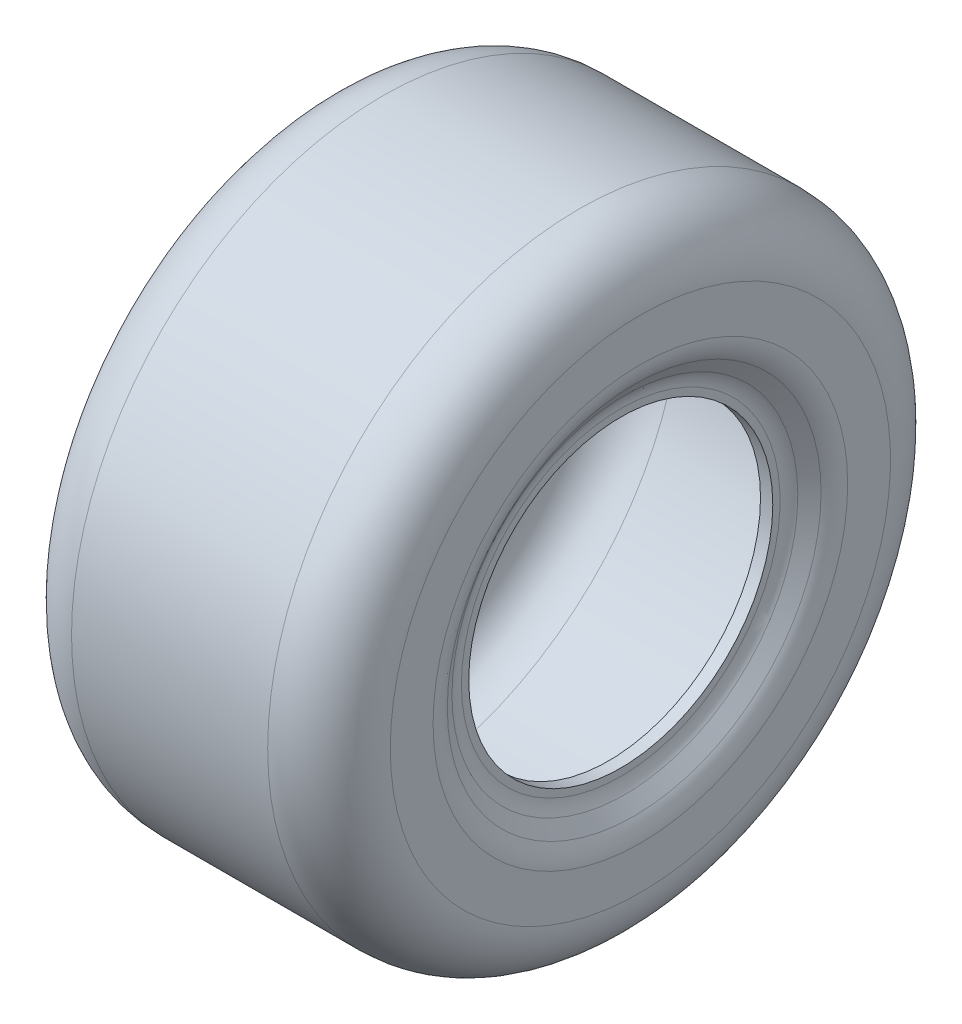
ISO-10303-21;
HEADER;
FILE_DESCRIPTION(('STEP AP214'),'2;1');
FILE_NAME('part.step','',(''),(''),'','','');
FILE_SCHEMA(('AUTOMOTIVE_DESIGN { 1 0 10303 214 1 1 1 1 }'));
ENDSEC;
DATA;
#1=APPLICATION_CONTEXT('core data for automotive mechanical design processes');
#2=APPLICATION_PROTOCOL_DEFINITION('international standard','automotive_design',2000,#1);
#3=PRODUCT_CONTEXT('',#1,'mechanical');
#4=PRODUCT('Part','Part','',(#3));
#5=PRODUCT_RELATED_PRODUCT_CATEGORY('part','',(#4));
#6=PRODUCT_DEFINITION_FORMATION('','',#4);
#7=PRODUCT_DEFINITION_CONTEXT('part definition',#1,'design');
#8=PRODUCT_DEFINITION('design','',#6,#7);
#9=PRODUCT_DEFINITION_SHAPE('','',#8);
#10=(LENGTH_UNIT() NAMED_UNIT(*) SI_UNIT(.MILLI.,.METRE.));
#11=(NAMED_UNIT(*) PLANE_ANGLE_UNIT() SI_UNIT($,.RADIAN.));
#12=(NAMED_UNIT(*) SI_UNIT($,.STERADIAN.) SOLID_ANGLE_UNIT());
#13=UNCERTAINTY_MEASURE_WITH_UNIT(LENGTH_MEASURE(1.E-05),#10,'distance_accuracy_value','');
#14=(GEOMETRIC_REPRESENTATION_CONTEXT(3) GLOBAL_UNCERTAINTY_ASSIGNED_CONTEXT((#13)) GLOBAL_UNIT_ASSIGNED_CONTEXT((#10,
#11,#12)) REPRESENTATION_CONTEXT('',''));
#15=CARTESIAN_POINT('',(0.,0.,0.));
#16=DIRECTION('',(0.,0.,1.));
#17=DIRECTION('',(1.,0.,0.));
#18=AXIS2_PLACEMENT_3D('',#15,#16,#17);
#19=CARTESIAN_POINT('',(-40.,0.,0.));
#20=DIRECTION('',(-1.,0.,0.));
#21=DIRECTION('',(0.,0.,1.));
#22=AXIS2_PLACEMENT_3D('',#19,#20,#21);
#23=TOROIDAL_SURFACE('',#22,102.,25.);
#24=CARTESIAN_POINT('',(-65.,0.,0.));
#25=DIRECTION('',(-1.,0.,0.));
#26=DIRECTION('',(0.,0.,1.));
#27=AXIS2_PLACEMENT_3D('',#24,#25,#26);
#28=CIRCLE('',#27,102.);
#29=CARTESIAN_POINT('',(-65.,0.,102.));
#30=VERTEX_POINT('',#29);
#31=EDGE_CURVE('E10',#30,#30,#28,.T.);
#32=ORIENTED_EDGE('',*,*,#31,.F.);
#33=EDGE_LOOP('',(#32));
#34=FACE_BOUND('',#33,.T.);
#35=CARTESIAN_POINT('',(-39.9999999999998,0.,0.));
#36=DIRECTION('',(-1.,0.,0.));
#37=DIRECTION('',(0.,0.,1.));
#38=AXIS2_PLACEMENT_3D('',#35,#36,#37);
#39=CIRCLE('',#38,127.);
#40=CARTESIAN_POINT('',(-39.9999999999998,0.,127.));
#41=VERTEX_POINT('',#40);
#42=EDGE_CURVE('E127',#41,#41,#39,.T.);
#43=ORIENTED_EDGE('',*,*,#42,.T.);
#44=EDGE_LOOP('',(#43));
#45=FACE_BOUND('',#44,.T.);
#46=ADVANCED_FACE('F39',(#34,#45),#23,.T.);
#47=CARTESIAN_POINT('',(-65.,102.,0.));
#48=DIRECTION('',(1.,0.,0.));
#49=DIRECTION('',(0.,0.,-1.));
#50=AXIS2_PLACEMENT_3D('',#47,#48,#49);
#51=PLANE('',#50);
#52=CARTESIAN_POINT('',(-65.,0.,0.));
#53=DIRECTION('',(-1.,0.,0.));
#54=DIRECTION('',(0.,0.,1.));
#55=AXIS2_PLACEMENT_3D('',#52,#53,#54);
#56=CIRCLE('',#55,84.54163456598);
#57=CARTESIAN_POINT('',(-65.,0.,84.54163456598));
#58=VERTEX_POINT('',#57);
#59=EDGE_CURVE('E45',#58,#58,#56,.T.);
#60=ORIENTED_EDGE('',*,*,#59,.F.);
#61=EDGE_LOOP('',(#60));
#62=FACE_BOUND('',#61,.T.);
#63=ORIENTED_EDGE('',*,*,#31,.T.);
#64=EDGE_LOOP('',(#63));
#65=FACE_BOUND('',#64,.T.);
#66=ADVANCED_FACE('F284',(#62,#65),#51,.F.);
#67=CARTESIAN_POINT('',(-50.,0.,0.));
#68=DIRECTION('',(-1.,0.,0.));
#69=DIRECTION('',(0.,0.,1.));
#70=AXIS2_PLACEMENT_3D('',#67,#68,#69);
#71=TOROIDAL_SURFACE('',#70,84.5416345659799,15.);
#72=CARTESIAN_POINT('',(-62.4807544150676,0.,0.));
#73=DIRECTION('',(-1.,0.,0.));
#74=DIRECTION('',(0.,0.,1.));
#75=AXIS2_PLACEMENT_3D('',#72,#73,#74);
#76=CIRCLE('',#75,76.2211316226014);
#77=CARTESIAN_POINT('',(-62.4807544150676,0.,76.2211316226014));
#78=VERTEX_POINT('',#77);
#79=EDGE_CURVE('E49',#78,#78,#76,.T.);
#80=ORIENTED_EDGE('',*,*,#79,.F.);
#81=EDGE_LOOP('',(#80));
#82=FACE_BOUND('',#81,.T.);
#83=ORIENTED_EDGE('',*,*,#59,.T.);
#84=EDGE_LOOP('',(#83));
#85=FACE_BOUND('',#84,.T.);
#86=ADVANCED_FACE('F279',(#82,#85),#71,.T.);
#87=CARTESIAN_POINT('',(-62.4807544150676,0.,0.));
#88=DIRECTION('',(-1.,0.,0.));
#89=DIRECTION('',(0.,0.,1.));
#90=AXIS2_PLACEMENT_3D('',#87,#88,#89);
#91=CONICAL_SURFACE('',#90,76.2211316226014,0.982793723247326);
#92=CARTESIAN_POINT('',(-58.6794970566216,0.,0.));
#93=DIRECTION('',(-1.,0.,0.));
#94=DIRECTION('',(0.,0.,1.));
#95=AXIS2_PLACEMENT_3D('',#92,#93,#94);
#96=CIRCLE('',#95,70.5192455849324);
#97=CARTESIAN_POINT('',(-58.6794970566216,0.,70.5192455849324));
#98=VERTEX_POINT('',#97);
#99=EDGE_CURVE('E53',#98,#98,#96,.T.);
#100=ORIENTED_EDGE('',*,*,#99,.F.);
#101=EDGE_LOOP('',(#100));
#102=FACE_BOUND('',#101,.T.);
#103=ORIENTED_EDGE('',*,*,#79,.T.);
#104=EDGE_LOOP('',(#103));
#105=FACE_BOUND('',#104,.T.);
#106=ADVANCED_FACE('F273',(#102,#105),#91,.F.);
#107=CARTESIAN_POINT('',(-67.,0.,0.));
#108=DIRECTION('',(-1.,0.,0.));
#109=DIRECTION('',(0.,0.,1.));
#110=AXIS2_PLACEMENT_3D('',#107,#108,#109);
#111=TOROIDAL_SURFACE('',#110,64.9722436226801,10.);
#112=CARTESIAN_POINT('',(-57.,0.,0.));
#113=DIRECTION('',(-1.,0.,0.));
#114=DIRECTION('',(0.,0.,1.));
#115=AXIS2_PLACEMENT_3D('',#112,#113,#114);
#116=CIRCLE('',#115,64.9722436226801);
#117=CARTESIAN_POINT('',(-57.,0.,64.9722436226801));
#118=VERTEX_POINT('',#117);
#119=EDGE_CURVE('E58',#118,#118,#116,.T.);
#120=ORIENTED_EDGE('',*,*,#119,.F.);
#121=EDGE_LOOP('',(#120));
#122=FACE_BOUND('',#121,.T.);
#123=ORIENTED_EDGE('',*,*,#99,.T.);
#124=EDGE_LOOP('',(#123));
#125=FACE_BOUND('',#124,.T.);
#126=ADVANCED_FACE('F267',(#122,#125),#111,.F.);
#127=CARTESIAN_POINT('',(-57.,64.9722436226801,0.));
#128=DIRECTION('',(1.,0.,0.));
#129=DIRECTION('',(0.,0.,-1.));
#130=AXIS2_PLACEMENT_3D('',#127,#128,#129);
#131=PLANE('',#130);
#132=CARTESIAN_POINT('',(-57.,0.,0.));
#133=DIRECTION('',(-1.,0.,0.));
#134=DIRECTION('',(0.,0.,1.));
#135=AXIS2_PLACEMENT_3D('',#132,#133,#134);
#136=CIRCLE('',#135,62.);
#137=CARTESIAN_POINT('',(-57.,0.,62.));
#138=VERTEX_POINT('',#137);
#139=EDGE_CURVE('E61',#138,#138,#136,.T.);
#140=ORIENTED_EDGE('',*,*,#139,.F.);
#141=EDGE_LOOP('',(#140));
#142=FACE_BOUND('',#141,.T.);
#143=ORIENTED_EDGE('',*,*,#119,.T.);
#144=EDGE_LOOP('',(#143));
#145=FACE_BOUND('',#144,.T.);
#146=ADVANCED_FACE('F261',(#142,#145),#131,.F.);
#147=CARTESIAN_POINT('',(-65.,0.,0.));
#148=DIRECTION('',(-1.,0.,0.));
#149=DIRECTION('',(0.,0.,1.));
#150=AXIS2_PLACEMENT_3D('',#147,#148,#149);
#151=CYLINDRICAL_SURFACE('',#150,62.);
#152=CARTESIAN_POINT('',(-52.,0.,0.));
#153=DIRECTION('',(-1.,0.,0.));
#154=DIRECTION('',(0.,0.,1.));
#155=AXIS2_PLACEMENT_3D('',#152,#153,#154);
#156=CIRCLE('',#155,62.);
#157=CARTESIAN_POINT('',(-52.,0.,62.));
#158=VERTEX_POINT('',#157);
#159=EDGE_CURVE('E64',#158,#158,#156,.T.);
#160=ORIENTED_EDGE('',*,*,#159,.F.);
#161=EDGE_LOOP('',(#160));
#162=FACE_BOUND('',#161,.T.);
#163=ORIENTED_EDGE('',*,*,#139,.T.);
#164=EDGE_LOOP('',(#163));
#165=FACE_BOUND('',#164,.T.);
#166=ADVANCED_FACE('F255',(#162,#165),#151,.F.);
#167=CARTESIAN_POINT('',(-52.,64.9722436226801,0.));
#168=DIRECTION('',(-1.,0.,0.));
#169=DIRECTION('',(0.,0.,1.));
#170=AXIS2_PLACEMENT_3D('',#167,#168,#169);
#171=PLANE('',#170);
#172=CARTESIAN_POINT('',(-52.,0.,0.));
#173=DIRECTION('',(-1.,0.,0.));
#174=DIRECTION('',(0.,0.,1.));
#175=AXIS2_PLACEMENT_3D('',#172,#173,#174);
#176=CIRCLE('',#175,64.9722436226801);
#177=CARTESIAN_POINT('',(-52.,0.,64.9722436226801));
#178=VERTEX_POINT('',#177);
#179=EDGE_CURVE('E67',#178,#178,#176,.T.);
#180=ORIENTED_EDGE('',*,*,#179,.F.);
#181=EDGE_LOOP('',(#180));
#182=FACE_BOUND('',#181,.T.);
#183=ORIENTED_EDGE('',*,*,#159,.T.);
#184=EDGE_LOOP('',(#183));
#185=FACE_BOUND('',#184,.T.);
#186=ADVANCED_FACE('F249',(#182,#185),#171,.F.);
#187=CARTESIAN_POINT('',(-67.,0.,0.));
#188=DIRECTION('',(-1.,0.,0.));
#189=DIRECTION('',(0.,0.,1.));
#190=AXIS2_PLACEMENT_3D('',#187,#188,#189);
#191=TOROIDAL_SURFACE('',#190,64.9722436226801,15.);
#192=CARTESIAN_POINT('',(-54.5192455849324,0.,0.));
#193=DIRECTION('',(-1.,0.,0.));
#194=DIRECTION('',(0.,0.,1.));
#195=AXIS2_PLACEMENT_3D('',#192,#193,#194);
#196=CIRCLE('',#195,73.2927465660585);
#197=CARTESIAN_POINT('',(-54.5192455849324,0.,73.2927465660585));
#198=VERTEX_POINT('',#197);
#199=EDGE_CURVE('E70',#198,#198,#196,.T.);
#200=ORIENTED_EDGE('',*,*,#199,.F.);
#201=EDGE_LOOP('',(#200));
#202=FACE_BOUND('',#201,.T.);
#203=ORIENTED_EDGE('',*,*,#179,.T.);
#204=EDGE_LOOP('',(#203));
#205=FACE_BOUND('',#204,.T.);
#206=ADVANCED_FACE('F243',(#202,#205),#191,.T.);
#207=CARTESIAN_POINT('',(-54.5192455849324,0.,0.));
#208=DIRECTION('',(-1.,0.,0.));
#209=DIRECTION('',(0.,0.,1.));
#210=AXIS2_PLACEMENT_3D('',#207,#208,#209);
#211=CONICAL_SURFACE('',#210,73.2927465660585,0.98279372324733);
#212=CARTESIAN_POINT('',(-58.3205029433784,0.,0.));
#213=DIRECTION('',(-1.,0.,0.));
#214=DIRECTION('',(0.,0.,1.));
#215=AXIS2_PLACEMENT_3D('',#212,#213,#214);
#216=CIRCLE('',#215,78.9946326037276);
#217=CARTESIAN_POINT('',(-58.3205029433784,0.,78.9946326037276));
#218=VERTEX_POINT('',#217);
#219=EDGE_CURVE('E73',#218,#218,#216,.T.);
#220=ORIENTED_EDGE('',*,*,#219,.F.);
#221=EDGE_LOOP('',(#220));
#222=FACE_BOUND('',#221,.T.);
#223=ORIENTED_EDGE('',*,*,#199,.T.);
#224=EDGE_LOOP('',(#223));
#225=FACE_BOUND('',#224,.T.);
#226=ADVANCED_FACE('F237',(#222,#225),#211,.T.);
#227=CARTESIAN_POINT('',(-50.,0.,0.));
#228=DIRECTION('',(-1.,0.,0.));
#229=DIRECTION('',(0.,0.,1.));
#230=AXIS2_PLACEMENT_3D('',#227,#228,#229);
#231=TOROIDAL_SURFACE('',#230,84.5416345659799,10.);
#232=CARTESIAN_POINT('',(-60.,0.,0.));
#233=DIRECTION('',(-1.,0.,0.));
#234=DIRECTION('',(0.,0.,1.));
#235=AXIS2_PLACEMENT_3D('',#232,#233,#234);
#236=CIRCLE('',#235,84.54163456598);
#237=CARTESIAN_POINT('',(-60.,0.,84.54163456598));
#238=VERTEX_POINT('',#237);
#239=EDGE_CURVE('E76',#238,#238,#236,.T.);
#240=ORIENTED_EDGE('',*,*,#239,.F.);
#241=EDGE_LOOP('',(#240));
#242=FACE_BOUND('',#241,.T.);
#243=ORIENTED_EDGE('',*,*,#219,.T.);
#244=EDGE_LOOP('',(#243));
#245=FACE_BOUND('',#244,.T.);
#246=ADVANCED_FACE('F231',(#242,#245),#231,.F.);
#247=CARTESIAN_POINT('',(-60.,102.,0.));
#248=DIRECTION('',(-1.,0.,0.));
#249=DIRECTION('',(0.,0.,1.));
#250=AXIS2_PLACEMENT_3D('',#247,#248,#249);
#251=PLANE('',#250);
#252=CARTESIAN_POINT('',(-60.,0.,0.));
#253=DIRECTION('',(-1.,0.,0.));
#254=DIRECTION('',(0.,0.,1.));
#255=AXIS2_PLACEMENT_3D('',#252,#253,#254);
#256=CIRCLE('',#255,102.);
#257=CARTESIAN_POINT('',(-60.,0.,102.));
#258=VERTEX_POINT('',#257);
#259=EDGE_CURVE('E79',#258,#258,#256,.T.);
#260=ORIENTED_EDGE('',*,*,#259,.F.);
#261=EDGE_LOOP('',(#260));
#262=FACE_BOUND('',#261,.T.);
#263=ORIENTED_EDGE('',*,*,#239,.T.);
#264=EDGE_LOOP('',(#263));
#265=FACE_BOUND('',#264,.T.);
#266=ADVANCED_FACE('F225',(#262,#265),#251,.F.);
#267=CARTESIAN_POINT('',(-40.,0.,0.));
#268=DIRECTION('',(-1.,0.,0.));
#269=DIRECTION('',(0.,0.,1.));
#270=AXIS2_PLACEMENT_3D('',#267,#268,#269);
#271=TOROIDAL_SURFACE('',#270,102.,20.);
#272=CARTESIAN_POINT('',(-39.9999999999998,0.,0.));
#273=DIRECTION('',(-1.,0.,0.));
#274=DIRECTION('',(0.,0.,1.));
#275=AXIS2_PLACEMENT_3D('',#272,#273,#274);
#276=CIRCLE('',#275,122.);
#277=CARTESIAN_POINT('',(-39.9999999999998,0.,122.));
#278=VERTEX_POINT('',#277);
#279=EDGE_CURVE('E82',#278,#278,#276,.T.);
#280=ORIENTED_EDGE('',*,*,#279,.F.);
#281=EDGE_LOOP('',(#280));
#282=FACE_BOUND('',#281,.T.);
#283=ORIENTED_EDGE('',*,*,#259,.T.);
#284=EDGE_LOOP('',(#283));
#285=FACE_BOUND('',#284,.T.);
#286=ADVANCED_FACE('F219',(#282,#285),#271,.F.);
#287=CARTESIAN_POINT('',(-65.,0.,0.));
#288=DIRECTION('',(-1.,0.,0.));
#289=DIRECTION('',(0.,0.,1.));
#290=AXIS2_PLACEMENT_3D('',#287,#288,#289);
#291=CYLINDRICAL_SURFACE('',#290,122.);
#292=CARTESIAN_POINT('',(39.9999999999998,0.,0.));
#293=DIRECTION('',(-1.,0.,0.));
#294=DIRECTION('',(0.,0.,1.));
#295=AXIS2_PLACEMENT_3D('',#292,#293,#294);
#296=CIRCLE('',#295,122.);
#297=CARTESIAN_POINT('',(39.9999999999998,0.,122.));
#298=VERTEX_POINT('',#297);
#299=EDGE_CURVE('E85',#298,#298,#296,.T.);
#300=ORIENTED_EDGE('',*,*,#299,.F.);
#301=EDGE_LOOP('',(#300));
#302=FACE_BOUND('',#301,.T.);
#303=ORIENTED_EDGE('',*,*,#279,.T.);
#304=EDGE_LOOP('',(#303));
#305=FACE_BOUND('',#304,.T.);
#306=ADVANCED_FACE('F213',(#302,#305),#291,.F.);
#307=CARTESIAN_POINT('',(40.,0.,0.));
#308=DIRECTION('',(-1.,0.,0.));
#309=DIRECTION('',(0.,0.,1.));
#310=AXIS2_PLACEMENT_3D('',#307,#308,#309);
#311=TOROIDAL_SURFACE('',#310,102.,20.);
#312=CARTESIAN_POINT('',(60.,0.,0.));
#313=DIRECTION('',(-1.,0.,0.));
#314=DIRECTION('',(0.,0.,1.));
#315=AXIS2_PLACEMENT_3D('',#312,#313,#314);
#316=CIRCLE('',#315,102.);
#317=CARTESIAN_POINT('',(60.,0.,102.));
#318=VERTEX_POINT('',#317);
#319=EDGE_CURVE('E88',#318,#318,#316,.T.);
#320=ORIENTED_EDGE('',*,*,#319,.F.);
#321=EDGE_LOOP('',(#320));
#322=FACE_BOUND('',#321,.T.);
#323=ORIENTED_EDGE('',*,*,#299,.T.);
#324=EDGE_LOOP('',(#323));
#325=FACE_BOUND('',#324,.T.);
#326=ADVANCED_FACE('F207',(#322,#325),#311,.F.);
#327=CARTESIAN_POINT('',(60.,102.,0.));
#328=DIRECTION('',(1.,0.,0.));
#329=DIRECTION('',(0.,0.,-1.));
#330=AXIS2_PLACEMENT_3D('',#327,#328,#329);
#331=PLANE('',#330);
#332=CARTESIAN_POINT('',(60.,0.,0.));
#333=DIRECTION('',(-1.,0.,0.));
#334=DIRECTION('',(0.,0.,1.));
#335=AXIS2_PLACEMENT_3D('',#332,#333,#334);
#336=CIRCLE('',#335,84.54163456598);
#337=CARTESIAN_POINT('',(60.,0.,84.54163456598));
#338=VERTEX_POINT('',#337);
#339=EDGE_CURVE('E91',#338,#338,#336,.T.);
#340=ORIENTED_EDGE('',*,*,#339,.F.);
#341=EDGE_LOOP('',(#340));
#342=FACE_BOUND('',#341,.T.);
#343=ORIENTED_EDGE('',*,*,#319,.T.);
#344=EDGE_LOOP('',(#343));
#345=FACE_BOUND('',#344,.T.);
#346=ADVANCED_FACE('F201',(#342,#345),#331,.F.);
#347=CARTESIAN_POINT('',(50.,0.,0.));
#348=DIRECTION('',(-1.,0.,0.));
#349=DIRECTION('',(0.,0.,1.));
#350=AXIS2_PLACEMENT_3D('',#347,#348,#349);
#351=TOROIDAL_SURFACE('',#350,84.5416345659799,10.);
#352=CARTESIAN_POINT('',(58.3205029433784,0.,0.));
#353=DIRECTION('',(-1.,0.,0.));
#354=DIRECTION('',(0.,0.,1.));
#355=AXIS2_PLACEMENT_3D('',#352,#353,#354);
#356=CIRCLE('',#355,78.9946326037276);
#357=CARTESIAN_POINT('',(58.3205029433784,0.,78.9946326037276));
#358=VERTEX_POINT('',#357);
#359=EDGE_CURVE('E94',#358,#358,#356,.T.);
#360=ORIENTED_EDGE('',*,*,#359,.F.);
#361=EDGE_LOOP('',(#360));
#362=FACE_BOUND('',#361,.T.);
#363=ORIENTED_EDGE('',*,*,#339,.T.);
#364=EDGE_LOOP('',(#363));
#365=FACE_BOUND('',#364,.T.);
#366=ADVANCED_FACE('F195',(#362,#365),#351,.F.);
#367=CARTESIAN_POINT('',(58.3205029433784,0.,0.));
#368=DIRECTION('',(1.,0.,0.));
#369=DIRECTION('',(0.,0.,-1.));
#370=AXIS2_PLACEMENT_3D('',#367,#368,#369);
#371=CONICAL_SURFACE('',#370,78.9946326037276,0.982793723247328);
#372=CARTESIAN_POINT('',(54.5192455849324,0.,0.));
#373=DIRECTION('',(-1.,0.,0.));
#374=DIRECTION('',(0.,0.,1.));
#375=AXIS2_PLACEMENT_3D('',#372,#373,#374);
#376=CIRCLE('',#375,73.2927465660585);
#377=CARTESIAN_POINT('',(54.5192455849324,0.,73.2927465660585));
#378=VERTEX_POINT('',#377);
#379=EDGE_CURVE('E97',#378,#378,#376,.T.);
#380=ORIENTED_EDGE('',*,*,#379,.F.);
#381=EDGE_LOOP('',(#380));
#382=FACE_BOUND('',#381,.T.);
#383=ORIENTED_EDGE('',*,*,#359,.T.);
#384=EDGE_LOOP('',(#383));
#385=FACE_BOUND('',#384,.T.);
#386=ADVANCED_FACE('F189',(#382,#385),#371,.T.);
#387=CARTESIAN_POINT('',(67.,0.,0.));
#388=DIRECTION('',(-1.,0.,0.));
#389=DIRECTION('',(0.,0.,1.));
#390=AXIS2_PLACEMENT_3D('',#387,#388,#389);
#391=TOROIDAL_SURFACE('',#390,64.9722436226801,15.);
#392=CARTESIAN_POINT('',(52.,0.,0.));
#393=DIRECTION('',(-1.,0.,0.));
#394=DIRECTION('',(0.,0.,1.));
#395=AXIS2_PLACEMENT_3D('',#392,#393,#394);
#396=CIRCLE('',#395,64.9722436226801);
#397=CARTESIAN_POINT('',(52.,0.,64.9722436226801));
#398=VERTEX_POINT('',#397);
#399=EDGE_CURVE('E100',#398,#398,#396,.T.);
#400=ORIENTED_EDGE('',*,*,#399,.F.);
#401=EDGE_LOOP('',(#400));
#402=FACE_BOUND('',#401,.T.);
#403=ORIENTED_EDGE('',*,*,#379,.T.);
#404=EDGE_LOOP('',(#403));
#405=FACE_BOUND('',#404,.T.);
#406=ADVANCED_FACE('F183',(#402,#405),#391,.T.);
#407=CARTESIAN_POINT('',(52.,64.9722436226801,0.));
#408=DIRECTION('',(1.,0.,0.));
#409=DIRECTION('',(0.,0.,-1.));
#410=AXIS2_PLACEMENT_3D('',#407,#408,#409);
#411=PLANE('',#410);
#412=CARTESIAN_POINT('',(52.,0.,0.));
#413=DIRECTION('',(-1.,0.,0.));
#414=DIRECTION('',(0.,0.,1.));
#415=AXIS2_PLACEMENT_3D('',#412,#413,#414);
#416=CIRCLE('',#415,62.);
#417=CARTESIAN_POINT('',(52.,0.,62.));
#418=VERTEX_POINT('',#417);
#419=EDGE_CURVE('E103',#418,#418,#416,.T.);
#420=ORIENTED_EDGE('',*,*,#419,.F.);
#421=EDGE_LOOP('',(#420));
#422=FACE_BOUND('',#421,.T.);
#423=ORIENTED_EDGE('',*,*,#399,.T.);
#424=EDGE_LOOP('',(#423));
#425=FACE_BOUND('',#424,.T.);
#426=ADVANCED_FACE('F177',(#422,#425),#411,.F.);
#427=CARTESIAN_POINT('',(-65.,0.,0.));
#428=DIRECTION('',(-1.,0.,0.));
#429=DIRECTION('',(0.,0.,1.));
#430=AXIS2_PLACEMENT_3D('',#427,#428,#429);
#431=CYLINDRICAL_SURFACE('',#430,62.);
#432=CARTESIAN_POINT('',(57.,0.,0.));
#433=DIRECTION('',(-1.,0.,0.));
#434=DIRECTION('',(0.,0.,1.));
#435=AXIS2_PLACEMENT_3D('',#432,#433,#434);
#436=CIRCLE('',#435,62.);
#437=CARTESIAN_POINT('',(57.,0.,62.));
#438=VERTEX_POINT('',#437);
#439=EDGE_CURVE('E106',#438,#438,#436,.T.);
#440=ORIENTED_EDGE('',*,*,#439,.F.);
#441=EDGE_LOOP('',(#440));
#442=FACE_BOUND('',#441,.T.);
#443=ORIENTED_EDGE('',*,*,#419,.T.);
#444=EDGE_LOOP('',(#443));
#445=FACE_BOUND('',#444,.T.);
#446=ADVANCED_FACE('F171',(#442,#445),#431,.F.);
#447=CARTESIAN_POINT('',(57.,64.9722436226801,0.));
#448=DIRECTION('',(-1.,0.,0.));
#449=DIRECTION('',(0.,0.,1.));
#450=AXIS2_PLACEMENT_3D('',#447,#448,#449);
#451=PLANE('',#450);
#452=CARTESIAN_POINT('',(57.,0.,0.));
#453=DIRECTION('',(-1.,0.,0.));
#454=DIRECTION('',(0.,0.,1.));
#455=AXIS2_PLACEMENT_3D('',#452,#453,#454);
#456=CIRCLE('',#455,64.9722436226801);
#457=CARTESIAN_POINT('',(57.,0.,64.9722436226801));
#458=VERTEX_POINT('',#457);
#459=EDGE_CURVE('E109',#458,#458,#456,.T.);
#460=ORIENTED_EDGE('',*,*,#459,.F.);
#461=EDGE_LOOP('',(#460));
#462=FACE_BOUND('',#461,.T.);
#463=ORIENTED_EDGE('',*,*,#439,.T.);
#464=EDGE_LOOP('',(#463));
#465=FACE_BOUND('',#464,.T.);
#466=ADVANCED_FACE('F165',(#462,#465),#451,.F.);
#467=CARTESIAN_POINT('',(67.,0.,0.));
#468=DIRECTION('',(-1.,0.,0.));
#469=DIRECTION('',(0.,0.,1.));
#470=AXIS2_PLACEMENT_3D('',#467,#468,#469);
#471=TOROIDAL_SURFACE('',#470,64.9722436226801,10.);
#472=CARTESIAN_POINT('',(58.6794970566216,0.,0.));
#473=DIRECTION('',(-1.,0.,0.));
#474=DIRECTION('',(0.,0.,1.));
#475=AXIS2_PLACEMENT_3D('',#472,#473,#474);
#476=CIRCLE('',#475,70.5192455849324);
#477=CARTESIAN_POINT('',(58.6794970566216,0.,70.5192455849324));
#478=VERTEX_POINT('',#477);
#479=EDGE_CURVE('E112',#478,#478,#476,.T.);
#480=ORIENTED_EDGE('',*,*,#479,.F.);
#481=EDGE_LOOP('',(#480));
#482=FACE_BOUND('',#481,.T.);
#483=ORIENTED_EDGE('',*,*,#459,.T.);
#484=EDGE_LOOP('',(#483));
#485=FACE_BOUND('',#484,.T.);
#486=ADVANCED_FACE('F159',(#482,#485),#471,.F.);
#487=CARTESIAN_POINT('',(58.6794970566216,0.,0.));
#488=DIRECTION('',(1.,0.,0.));
#489=DIRECTION('',(0.,0.,-1.));
#490=AXIS2_PLACEMENT_3D('',#487,#488,#489);
#491=CONICAL_SURFACE('',#490,70.5192455849324,0.982793723247328);
#492=CARTESIAN_POINT('',(62.4807544150676,0.,0.));
#493=DIRECTION('',(-1.,0.,0.));
#494=DIRECTION('',(0.,0.,1.));
#495=AXIS2_PLACEMENT_3D('',#492,#493,#494);
#496=CIRCLE('',#495,76.2211316226014);
#497=CARTESIAN_POINT('',(62.4807544150676,0.,76.2211316226014));
#498=VERTEX_POINT('',#497);
#499=EDGE_CURVE('E115',#498,#498,#496,.T.);
#500=ORIENTED_EDGE('',*,*,#499,.F.);
#501=EDGE_LOOP('',(#500));
#502=FACE_BOUND('',#501,.T.);
#503=ORIENTED_EDGE('',*,*,#479,.T.);
#504=EDGE_LOOP('',(#503));
#505=FACE_BOUND('',#504,.T.);
#506=ADVANCED_FACE('F153',(#502,#505),#491,.F.);
#507=CARTESIAN_POINT('',(50.,0.,0.));
#508=DIRECTION('',(-1.,0.,0.));
#509=DIRECTION('',(0.,0.,1.));
#510=AXIS2_PLACEMENT_3D('',#507,#508,#509);
#511=TOROIDAL_SURFACE('',#510,84.5416345659799,15.);
#512=CARTESIAN_POINT('',(65.,0.,0.));
#513=DIRECTION('',(-1.,0.,0.));
#514=DIRECTION('',(0.,0.,1.));
#515=AXIS2_PLACEMENT_3D('',#512,#513,#514);
#516=CIRCLE('',#515,84.54163456598);
#517=CARTESIAN_POINT('',(65.,0.,84.54163456598));
#518=VERTEX_POINT('',#517);
#519=EDGE_CURVE('E118',#518,#518,#516,.T.);
#520=ORIENTED_EDGE('',*,*,#519,.F.);
#521=EDGE_LOOP('',(#520));
#522=FACE_BOUND('',#521,.T.);
#523=ORIENTED_EDGE('',*,*,#499,.T.);
#524=EDGE_LOOP('',(#523));
#525=FACE_BOUND('',#524,.T.);
#526=ADVANCED_FACE('F147',(#522,#525),#511,.T.);
#527=CARTESIAN_POINT('',(65.,102.,0.));
#528=DIRECTION('',(-1.,0.,0.));
#529=DIRECTION('',(0.,0.,1.));
#530=AXIS2_PLACEMENT_3D('',#527,#528,#529);
#531=PLANE('',#530);
#532=CARTESIAN_POINT('',(65.,0.,0.));
#533=DIRECTION('',(-1.,0.,0.));
#534=DIRECTION('',(0.,0.,1.));
#535=AXIS2_PLACEMENT_3D('',#532,#533,#534);
#536=CIRCLE('',#535,102.);
#537=CARTESIAN_POINT('',(65.,0.,102.));
#538=VERTEX_POINT('',#537);
#539=EDGE_CURVE('E121',#538,#538,#536,.T.);
#540=ORIENTED_EDGE('',*,*,#539,.F.);
#541=EDGE_LOOP('',(#540));
#542=FACE_BOUND('',#541,.T.);
#543=ORIENTED_EDGE('',*,*,#519,.T.);
#544=EDGE_LOOP('',(#543));
#545=FACE_BOUND('',#544,.T.);
#546=ADVANCED_FACE('F141',(#542,#545),#531,.F.);
#547=CARTESIAN_POINT('',(40.,0.,0.));
#548=DIRECTION('',(-1.,0.,0.));
#549=DIRECTION('',(0.,0.,1.));
#550=AXIS2_PLACEMENT_3D('',#547,#548,#549);
#551=TOROIDAL_SURFACE('',#550,102.,25.);
#552=CARTESIAN_POINT('',(39.9999999999998,0.,0.));
#553=DIRECTION('',(-1.,0.,0.));
#554=DIRECTION('',(0.,0.,1.));
#555=AXIS2_PLACEMENT_3D('',#552,#553,#554);
#556=CIRCLE('',#555,127.);
#557=CARTESIAN_POINT('',(39.9999999999998,0.,127.));
#558=VERTEX_POINT('',#557);
#559=EDGE_CURVE('E124',#558,#558,#556,.T.);
#560=ORIENTED_EDGE('',*,*,#559,.F.);
#561=EDGE_LOOP('',(#560));
#562=FACE_BOUND('',#561,.T.);
#563=ORIENTED_EDGE('',*,*,#539,.T.);
#564=EDGE_LOOP('',(#563));
#565=FACE_BOUND('',#564,.T.);
#566=ADVANCED_FACE('F135',(#562,#565),#551,.T.);
#567=CARTESIAN_POINT('',(-65.,0.,0.));
#568=DIRECTION('',(-1.,0.,0.));
#569=DIRECTION('',(0.,0.,1.));
#570=AXIS2_PLACEMENT_3D('',#567,#568,#569);
#571=CYLINDRICAL_SURFACE('',#570,127.);
#572=ORIENTED_EDGE('',*,*,#42,.F.);
#573=EDGE_LOOP('',(#572));
#574=FACE_BOUND('',#573,.T.);
#575=ORIENTED_EDGE('',*,*,#559,.T.);
#576=EDGE_LOOP('',(#575));
#577=FACE_BOUND('',#576,.T.);
#578=ADVANCED_FACE('F132',(#574,#577),#571,.T.);
#579=CLOSED_SHELL('',(#46,#66,#86,#106,#126,#146,#166,#186,#206,#226,#246,#266,#286,#306,#326,
#346,#366,#386,#406,#426,#446,#466,#486,#506,#526,#546,#566,#578));
#580=MANIFOLD_SOLID_BREP('B2',#579);
#581=ADVANCED_BREP_SHAPE_REPRESENTATION('',(#18,#580),#14);
#582=SHAPE_DEFINITION_REPRESENTATION(#9,#581);
ENDSEC;
END-ISO-10303-21;
